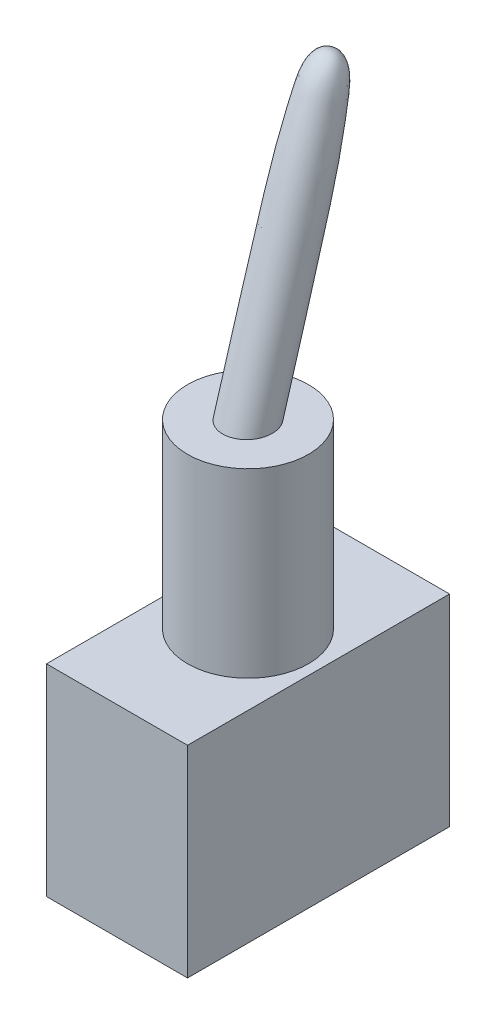
ISO-10303-21;
HEADER;
FILE_DESCRIPTION(('STEP AP214'),'2;1');
FILE_NAME('part.step','',(''),(''),'','','');
FILE_SCHEMA(('AUTOMOTIVE_DESIGN { 1 0 10303 214 1 1 1 1 }'));
ENDSEC;
DATA;
#1=APPLICATION_CONTEXT('core data for automotive mechanical design processes');
#2=APPLICATION_PROTOCOL_DEFINITION('international standard','automotive_design',2000,#1);
#3=PRODUCT_CONTEXT('',#1,'mechanical');
#4=PRODUCT('Part','Part','',(#3));
#5=PRODUCT_RELATED_PRODUCT_CATEGORY('part','',(#4));
#6=PRODUCT_DEFINITION_FORMATION('','',#4);
#7=PRODUCT_DEFINITION_CONTEXT('part definition',#1,'design');
#8=PRODUCT_DEFINITION('design','',#6,#7);
#9=PRODUCT_DEFINITION_SHAPE('','',#8);
#10=(LENGTH_UNIT() NAMED_UNIT(*) SI_UNIT(.MILLI.,.METRE.));
#11=(NAMED_UNIT(*) PLANE_ANGLE_UNIT() SI_UNIT($,.RADIAN.));
#12=(NAMED_UNIT(*) SI_UNIT($,.STERADIAN.) SOLID_ANGLE_UNIT());
#13=UNCERTAINTY_MEASURE_WITH_UNIT(LENGTH_MEASURE(1.E-05),#10,'distance_accuracy_value','');
#14=(GEOMETRIC_REPRESENTATION_CONTEXT(3) GLOBAL_UNCERTAINTY_ASSIGNED_CONTEXT((#13)) GLOBAL_UNIT_ASSIGNED_CONTEXT((#10,
#11,#12)) REPRESENTATION_CONTEXT('',''));
#15=CARTESIAN_POINT('',(0.,0.,0.));
#16=DIRECTION('',(0.,0.,1.));
#17=DIRECTION('',(1.,0.,0.));
#18=AXIS2_PLACEMENT_3D('',#15,#16,#17);
#19=CARTESIAN_POINT('',(3.5,19.,-6.5));
#20=DIRECTION('',(0.,-0.959087179869541,0.283110899489742));
#21=DIRECTION('',(0.,-0.283110899489742,-0.959087179869541));
#22=AXIS2_PLACEMENT_3D('',#19,#20,#21);
#23=CONICAL_SURFACE('',#22,0.,1.01866500650437);
#24=CARTESIAN_POINT('',(3.5,18.2892350729319,-6.29019081679791));
#25=DIRECTION('',(0.,-0.959087179869541,0.283110899489742));
#26=DIRECTION('',(0.,-0.283110899489742,-0.959087179869541));
#27=AXIS2_PLACEMENT_3D('',#24,#25,#26);
#28=CIRCLE('',#27,1.2029786225424);
#29=CARTESIAN_POINT('',(3.5,17.948658713037,-7.44395219133544));
#30=VERTEX_POINT('',#29);
#31=EDGE_CURVE('E12',#30,#30,#28,.T.);
#32=ORIENTED_EDGE('',*,*,#31,.T.);
#33=EDGE_LOOP('',(#32));
#34=FACE_BOUND('',#33,.T.);
#35=CARTESIAN_POINT('',(3.5,19.,-6.5));
#36=VERTEX_POINT('',#35);
#37=VERTEX_LOOP('',#36);
#38=FACE_BOUND('',#37,.T.);
#39=ADVANCED_FACE('F51',(#34,#38),#23,.F.);
#40=CARTESIAN_POINT('',(3.5,17.948658713037,-7.44395219133544));
#41=CARTESIAN_POINT('',(3.5,28.0593610616712,-10.4285088577943));
#42=CARTESIAN_POINT('',(3.5,28.1123899952393,-10.4384988236411));
#43=CARTESIAN_POINT('',(3.5,31.9325798483863,-11.2795308449674));
#44=CARTESIAN_POINT('',(3.5,32.7695795509076,-11.0661832177006));
#45=CARTESIAN_POINT('',(3.5,32.905769973454,-10.6048145861125));
#46=B_SPLINE_CURVE_WITH_KNOTS('',3,(#40,#41,#42,#43,#44,#45),.UNSPECIFIED.,.F.,.F.,(4,1,1,4),
(0.,0.780285363158432,0.880285363158432,1.),.UNSPECIFIED.);
#47=CARTESIAN_POINT('',(3.5,19.,-6.5));
#48=DIRECTION('',(0.,-0.959087179869541,0.283110899489742));
#49=AXIS1_PLACEMENT('',#47,#48);
#50=SURFACE_OF_REVOLUTION('',#46,#49);
#51=CARTESIAN_POINT('',(3.5,32.905769973454,-10.6048145861125));
#52=VERTEX_POINT('',#51);
#53=VERTEX_LOOP('',#52);
#54=FACE_BOUND('',#53,.T.);
#55=ORIENTED_EDGE('',*,*,#31,.F.);
#56=EDGE_LOOP('',(#55));
#57=FACE_BOUND('',#56,.T.);
#58=ADVANCED_FACE('F63',(#54,#57),#50,.F.);
#59=CLOSED_SHELL('',(#39,#58));
#60=MANIFOLD_SOLID_BREP('B2',#59);
#61=CARTESIAN_POINT('',(0.,10.,0.));
#62=DIRECTION('',(1.,0.,0.));
#63=DIRECTION('',(0.,0.,-1.));
#64=AXIS2_PLACEMENT_3D('',#61,#62,#63);
#65=PLANE('',#64);
#66=DIRECTION('',(0.,0.,1.));
#67=VECTOR('',#66,1.);
#68=CARTESIAN_POINT('',(0.,0.,0.));
#69=LINE('',#68,#67);
#70=CARTESIAN_POINT('',(0.,0.,-13.));
#71=VERTEX_POINT('',#70);
#72=CARTESIAN_POINT('',(0.,0.,0.));
#73=VERTEX_POINT('',#72);
#74=EDGE_CURVE('E160',#71,#73,#69,.T.);
#75=ORIENTED_EDGE('',*,*,#74,.T.);
#76=DIRECTION('',(0.,-1.,0.));
#77=VECTOR('',#76,1.);
#78=CARTESIAN_POINT('',(0.,10.,0.));
#79=LINE('',#78,#77);
#80=CARTESIAN_POINT('',(0.,10.,0.));
#81=VERTEX_POINT('',#80);
#82=EDGE_CURVE('E97',#81,#73,#79,.T.);
#83=ORIENTED_EDGE('',*,*,#82,.F.);
#84=DIRECTION('',(0.,0.,1.));
#85=VECTOR('',#84,1.);
#86=CARTESIAN_POINT('',(0.,10.,0.));
#87=LINE('',#86,#85);
#88=CARTESIAN_POINT('',(0.,10.,-13.));
#89=VERTEX_POINT('',#88);
#90=EDGE_CURVE('E147',#89,#81,#87,.T.);
#91=ORIENTED_EDGE('',*,*,#90,.F.);
#92=DIRECTION('',(0.,-1.,0.));
#93=VECTOR('',#92,1.);
#94=CARTESIAN_POINT('',(0.,10.,-13.));
#95=LINE('',#94,#93);
#96=EDGE_CURVE('E156',#89,#71,#95,.T.);
#97=ORIENTED_EDGE('',*,*,#96,.T.);
#98=EDGE_LOOP('',(#75,#83,#91,#97));
#99=FACE_BOUND('',#98,.T.);
#100=ADVANCED_FACE('F94',(#99),#65,.F.);
#101=CARTESIAN_POINT('',(0.,10.,0.));
#102=DIRECTION('',(0.,0.,-1.));
#103=DIRECTION('',(-1.,0.,0.));
#104=AXIS2_PLACEMENT_3D('',#101,#102,#103);
#105=PLANE('',#104);
#106=DIRECTION('',(1.,0.,0.));
#107=VECTOR('',#106,1.);
#108=CARTESIAN_POINT('',(0.,0.,0.));
#109=LINE('',#108,#107);
#110=CARTESIAN_POINT('',(7.,0.,0.));
#111=VERTEX_POINT('',#110);
#112=EDGE_CURVE('E152',#73,#111,#109,.T.);
#113=ORIENTED_EDGE('',*,*,#112,.T.);
#114=DIRECTION('',(0.,-1.,0.));
#115=VECTOR('',#114,1.);
#116=CARTESIAN_POINT('',(7.,10.,0.));
#117=LINE('',#116,#115);
#118=CARTESIAN_POINT('',(7.,10.,0.));
#119=VERTEX_POINT('',#118);
#120=EDGE_CURVE('E150',#119,#111,#117,.T.);
#121=ORIENTED_EDGE('',*,*,#120,.F.);
#122=DIRECTION('',(1.,0.,0.));
#123=VECTOR('',#122,1.);
#124=CARTESIAN_POINT('',(0.,10.,0.));
#125=LINE('',#124,#123);
#126=EDGE_CURVE('E142',#81,#119,#125,.T.);
#127=ORIENTED_EDGE('',*,*,#126,.F.);
#128=ORIENTED_EDGE('',*,*,#82,.T.);
#129=EDGE_LOOP('',(#113,#121,#127,#128));
#130=FACE_BOUND('',#129,.T.);
#131=ADVANCED_FACE('F151',(#130),#105,.F.);
#132=CARTESIAN_POINT('',(7.,10.,0.));
#133=DIRECTION('',(-1.,0.,0.));
#134=DIRECTION('',(0.,0.,1.));
#135=AXIS2_PLACEMENT_3D('',#132,#133,#134);
#136=PLANE('',#135);
#137=DIRECTION('',(0.,0.,-1.));
#138=VECTOR('',#137,1.);
#139=CARTESIAN_POINT('',(7.,0.,0.));
#140=LINE('',#139,#138);
#141=CARTESIAN_POINT('',(7.,0.,-13.));
#142=VERTEX_POINT('',#141);
#143=EDGE_CURVE('E128',#111,#142,#140,.T.);
#144=ORIENTED_EDGE('',*,*,#143,.T.);
#145=DIRECTION('',(0.,-1.,0.));
#146=VECTOR('',#145,1.);
#147=CARTESIAN_POINT('',(7.,10.,-13.));
#148=LINE('',#147,#146);
#149=CARTESIAN_POINT('',(7.,10.,-13.));
#150=VERTEX_POINT('',#149);
#151=EDGE_CURVE('E153',#150,#142,#148,.T.);
#152=ORIENTED_EDGE('',*,*,#151,.F.);
#153=DIRECTION('',(0.,0.,-1.));
#154=VECTOR('',#153,1.);
#155=CARTESIAN_POINT('',(7.,10.,0.));
#156=LINE('',#155,#154);
#157=EDGE_CURVE('E145',#119,#150,#156,.T.);
#158=ORIENTED_EDGE('',*,*,#157,.F.);
#159=ORIENTED_EDGE('',*,*,#120,.T.);
#160=EDGE_LOOP('',(#144,#152,#158,#159));
#161=FACE_BOUND('',#160,.T.);
#162=ADVANCED_FACE('F154',(#161),#136,.F.);
#163=CARTESIAN_POINT('',(0.,10.,-13.));
#164=DIRECTION('',(0.,0.,1.));
#165=DIRECTION('',(1.,0.,0.));
#166=AXIS2_PLACEMENT_3D('',#163,#164,#165);
#167=PLANE('',#166);
#168=DIRECTION('',(-1.,0.,0.));
#169=VECTOR('',#168,1.);
#170=CARTESIAN_POINT('',(0.,0.,-13.));
#171=LINE('',#170,#169);
#172=EDGE_CURVE('E134',#142,#71,#171,.T.);
#173=ORIENTED_EDGE('',*,*,#172,.T.);
#174=ORIENTED_EDGE('',*,*,#96,.F.);
#175=DIRECTION('',(-1.,0.,0.));
#176=VECTOR('',#175,1.);
#177=CARTESIAN_POINT('',(0.,10.,-13.));
#178=LINE('',#177,#176);
#179=EDGE_CURVE('E111',#150,#89,#178,.T.);
#180=ORIENTED_EDGE('',*,*,#179,.F.);
#181=ORIENTED_EDGE('',*,*,#151,.T.);
#182=EDGE_LOOP('',(#173,#174,#180,#181));
#183=FACE_BOUND('',#182,.T.);
#184=ADVANCED_FACE('F168',(#183),#167,.F.);
#185=CARTESIAN_POINT('',(0.,10.,0.));
#186=DIRECTION('',(0.,-1.,0.));
#187=DIRECTION('',(0.,0.,-1.));
#188=AXIS2_PLACEMENT_3D('',#185,#186,#187);
#189=PLANE('',#188);
#190=CARTESIAN_POINT('',(3.5,10.,-6.5));
#191=DIRECTION('',(0.,1.,0.));
#192=DIRECTION('',(0.,0.,1.));
#193=AXIS2_PLACEMENT_3D('',#190,#191,#192);
#194=CIRCLE('',#193,3.);
#195=CARTESIAN_POINT('',(3.5,10.,-3.5));
#196=VERTEX_POINT('',#195);
#197=EDGE_CURVE('E49',#196,#196,#194,.T.);
#198=ORIENTED_EDGE('',*,*,#197,.F.);
#199=EDGE_LOOP('',(#198));
#200=FACE_BOUND('',#199,.T.);
#201=ORIENTED_EDGE('',*,*,#90,.T.);
#202=ORIENTED_EDGE('',*,*,#126,.T.);
#203=ORIENTED_EDGE('',*,*,#157,.T.);
#204=ORIENTED_EDGE('',*,*,#179,.T.);
#205=EDGE_LOOP('',(#201,#202,#203,#204));
#206=FACE_BOUND('',#205,.T.);
#207=ADVANCED_FACE('F143',(#200,#206),#189,.F.);
#208=CARTESIAN_POINT('',(0.,0.,0.));
#209=DIRECTION('',(0.,-1.,0.));
#210=DIRECTION('',(0.,0.,-1.));
#211=AXIS2_PLACEMENT_3D('',#208,#209,#210);
#212=PLANE('',#211);
#213=ORIENTED_EDGE('',*,*,#74,.F.);
#214=ORIENTED_EDGE('',*,*,#172,.F.);
#215=ORIENTED_EDGE('',*,*,#143,.F.);
#216=ORIENTED_EDGE('',*,*,#112,.F.);
#217=EDGE_LOOP('',(#213,#214,#215,#216));
#218=FACE_BOUND('',#217,.T.);
#219=ADVANCED_FACE('F171',(#218),#212,.T.);
#220=CARTESIAN_POINT('',(3.5,19.,-6.5));
#221=DIRECTION('',(0.,-1.,0.));
#222=DIRECTION('',(0.,0.,-1.));
#223=AXIS2_PLACEMENT_3D('',#220,#221,#222);
#224=CYLINDRICAL_SURFACE('',#223,3.);
#225=CARTESIAN_POINT('',(3.5,19.,-6.5));
#226=DIRECTION('',(0.,1.,0.));
#227=DIRECTION('',(0.,0.,1.));
#228=AXIS2_PLACEMENT_3D('',#225,#226,#227);
#229=CIRCLE('',#228,3.);
#230=CARTESIAN_POINT('',(3.5,19.,-3.5));
#231=VERTEX_POINT('',#230);
#232=EDGE_CURVE('E163',#231,#231,#229,.T.);
#233=ORIENTED_EDGE('',*,*,#232,.F.);
#234=EDGE_LOOP('',(#233));
#235=FACE_BOUND('',#234,.T.);
#236=ORIENTED_EDGE('',*,*,#197,.T.);
#237=EDGE_LOOP('',(#236));
#238=FACE_BOUND('',#237,.T.);
#239=ADVANCED_FACE('F179',(#235,#238),#224,.T.);
#240=CARTESIAN_POINT('',(3.5,19.,-6.5));
#241=DIRECTION('',(0.,1.,0.));
#242=DIRECTION('',(0.,0.,1.));
#243=AXIS2_PLACEMENT_3D('',#240,#241,#242);
#244=PLANE('',#243);
#245=ORIENTED_EDGE('',*,*,#232,.T.);
#246=EDGE_LOOP('',(#245));
#247=FACE_BOUND('',#246,.T.);
#248=ADVANCED_FACE('F177',(#247),#244,.T.);
#249=CLOSED_SHELL('',(#100,#131,#162,#184,#207,#219,#239,#248));
#250=MANIFOLD_SOLID_BREP('B6',#249);
#251=ADVANCED_BREP_SHAPE_REPRESENTATION('',(#18,#60,#250),#14);
#252=SHAPE_DEFINITION_REPRESENTATION(#9,#251);
ENDSEC;
END-ISO-10303-21;
